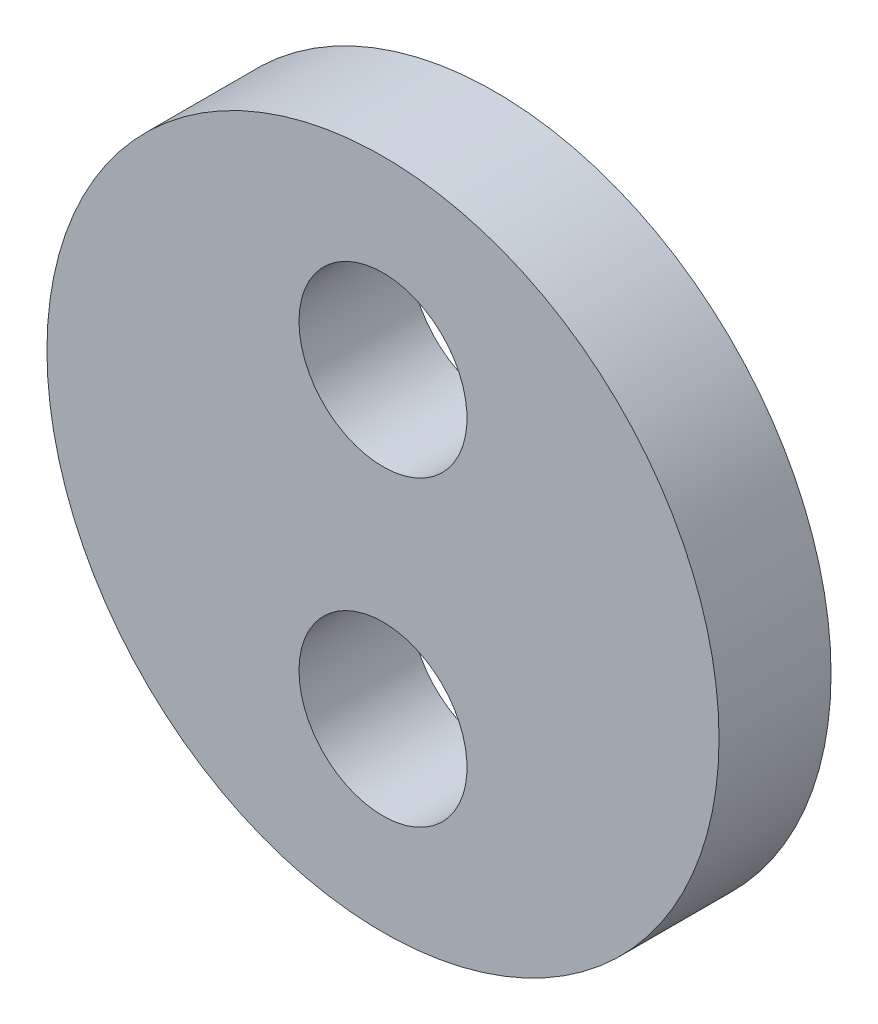
ISO-10303-21;
HEADER;
FILE_DESCRIPTION(('STEP AP214'),'2;1');
FILE_NAME('part.step','',(''),(''),'','','');
FILE_SCHEMA(('AUTOMOTIVE_DESIGN { 1 0 10303 214 1 1 1 1 }'));
ENDSEC;
DATA;
#1=APPLICATION_CONTEXT('core data for automotive mechanical design processes');
#2=APPLICATION_PROTOCOL_DEFINITION('international standard','automotive_design',2000,#1);
#3=PRODUCT_CONTEXT('',#1,'mechanical');
#4=PRODUCT('Part','Part','',(#3));
#5=PRODUCT_RELATED_PRODUCT_CATEGORY('part','',(#4));
#6=PRODUCT_DEFINITION_FORMATION('','',#4);
#7=PRODUCT_DEFINITION_CONTEXT('part definition',#1,'design');
#8=PRODUCT_DEFINITION('design','',#6,#7);
#9=PRODUCT_DEFINITION_SHAPE('','',#8);
#10=(LENGTH_UNIT() NAMED_UNIT(*) SI_UNIT(.MILLI.,.METRE.));
#11=(NAMED_UNIT(*) PLANE_ANGLE_UNIT() SI_UNIT($,.RADIAN.));
#12=(NAMED_UNIT(*) SI_UNIT($,.STERADIAN.) SOLID_ANGLE_UNIT());
#13=UNCERTAINTY_MEASURE_WITH_UNIT(LENGTH_MEASURE(1.E-05),#10,'distance_accuracy_value','');
#14=(GEOMETRIC_REPRESENTATION_CONTEXT(3) GLOBAL_UNCERTAINTY_ASSIGNED_CONTEXT((#13)) GLOBAL_UNIT_ASSIGNED_CONTEXT((#10,
#11,#12)) REPRESENTATION_CONTEXT('',''));
#15=CARTESIAN_POINT('',(0.,0.,0.));
#16=DIRECTION('',(0.,0.,1.));
#17=DIRECTION('',(1.,0.,0.));
#18=AXIS2_PLACEMENT_3D('',#15,#16,#17);
#19=CARTESIAN_POINT('',(0.,-2.02158585779104E-13,2.5));
#20=DIRECTION('',(0.,0.,-1.));
#21=DIRECTION('',(-1.,0.,0.));
#22=AXIS2_PLACEMENT_3D('',#19,#20,#21);
#23=CYLINDRICAL_SURFACE('',#22,6.00000000000001);
#24=CARTESIAN_POINT('',(0.,-2.02158585779104E-13,2.5));
#25=DIRECTION('',(0.,0.,-1.));
#26=DIRECTION('',(-1.,0.,0.));
#27=AXIS2_PLACEMENT_3D('',#24,#25,#26);
#28=CIRCLE('',#27,6.00000000000001);
#29=CARTESIAN_POINT('',(-5.99999999999996,-2.02158585779104E-13,2.5));
#30=VERTEX_POINT('',#29);
#31=EDGE_CURVE('E11',#30,#30,#28,.T.);
#32=ORIENTED_EDGE('',*,*,#31,.T.);
#33=EDGE_LOOP('',(#32));
#34=FACE_BOUND('',#33,.T.);
#35=CARTESIAN_POINT('',(0.,-2.02158585779104E-13,0.5));
#36=DIRECTION('',(0.,0.,-1.));
#37=DIRECTION('',(-1.,0.,0.));
#38=AXIS2_PLACEMENT_3D('',#35,#36,#37);
#39=CIRCLE('',#38,6.00000000000001);
#40=CARTESIAN_POINT('',(-5.99999999999996,-2.02158585779104E-13,0.499999999999999));
#41=VERTEX_POINT('',#40);
#42=EDGE_CURVE('E43',#41,#41,#39,.T.);
#43=ORIENTED_EDGE('',*,*,#42,.F.);
#44=EDGE_LOOP('',(#43));
#45=FACE_BOUND('',#44,.T.);
#46=ADVANCED_FACE('F40',(#34,#45),#23,.T.);
#47=CARTESIAN_POINT('',(0.,-2.02158585779104E-13,2.5));
#48=DIRECTION('',(0.,0.,-1.));
#49=DIRECTION('',(-1.,0.,0.));
#50=AXIS2_PLACEMENT_3D('',#47,#48,#49);
#51=PLANE('',#50);
#52=CARTESIAN_POINT('',(0.,-2.7,2.5));
#53=DIRECTION('',(0.,0.,-1.));
#54=DIRECTION('',(-1.,0.,0.));
#55=AXIS2_PLACEMENT_3D('',#52,#53,#54);
#56=CIRCLE('',#55,1.5);
#57=CARTESIAN_POINT('',(-1.5,-2.7,2.5));
#58=VERTEX_POINT('',#57);
#59=EDGE_CURVE('E55',#58,#58,#56,.T.);
#60=ORIENTED_EDGE('',*,*,#59,.T.);
#61=EDGE_LOOP('',(#60));
#62=FACE_BOUND('',#61,.T.);
#63=CARTESIAN_POINT('',(0.,2.7,2.5));
#64=DIRECTION('',(0.,0.,-1.));
#65=DIRECTION('',(-1.,0.,0.));
#66=AXIS2_PLACEMENT_3D('',#63,#64,#65);
#67=CIRCLE('',#66,1.5);
#68=CARTESIAN_POINT('',(-1.5,2.7,2.5));
#69=VERTEX_POINT('',#68);
#70=EDGE_CURVE('E50',#69,#69,#67,.T.);
#71=ORIENTED_EDGE('',*,*,#70,.T.);
#72=EDGE_LOOP('',(#71));
#73=FACE_BOUND('',#72,.T.);
#74=ORIENTED_EDGE('',*,*,#31,.F.);
#75=EDGE_LOOP('',(#74));
#76=FACE_BOUND('',#75,.T.);
#77=ADVANCED_FACE('F64',(#62,#73,#76),#51,.F.);
#78=CARTESIAN_POINT('',(0.,-2.02158585779104E-13,0.5));
#79=DIRECTION('',(0.,0.,-1.));
#80=DIRECTION('',(-1.,0.,0.));
#81=AXIS2_PLACEMENT_3D('',#78,#79,#80);
#82=PLANE('',#81);
#83=CARTESIAN_POINT('',(0.,-2.7,0.5));
#84=DIRECTION('',(0.,0.,-1.));
#85=DIRECTION('',(-1.,0.,0.));
#86=AXIS2_PLACEMENT_3D('',#83,#84,#85);
#87=CIRCLE('',#86,1.5);
#88=CARTESIAN_POINT('',(-1.5,-2.7,0.5));
#89=VERTEX_POINT('',#88);
#90=EDGE_CURVE('E58',#89,#89,#87,.T.);
#91=ORIENTED_EDGE('',*,*,#90,.F.);
#92=EDGE_LOOP('',(#91));
#93=FACE_BOUND('',#92,.T.);
#94=CARTESIAN_POINT('',(0.,2.7,0.5));
#95=DIRECTION('',(0.,0.,-1.));
#96=DIRECTION('',(-1.,0.,0.));
#97=AXIS2_PLACEMENT_3D('',#94,#95,#96);
#98=CIRCLE('',#97,1.5);
#99=CARTESIAN_POINT('',(-1.5,2.7,0.5));
#100=VERTEX_POINT('',#99);
#101=EDGE_CURVE('E52',#100,#100,#98,.T.);
#102=ORIENTED_EDGE('',*,*,#101,.F.);
#103=EDGE_LOOP('',(#102));
#104=FACE_BOUND('',#103,.T.);
#105=ORIENTED_EDGE('',*,*,#42,.T.);
#106=EDGE_LOOP('',(#105));
#107=FACE_BOUND('',#106,.T.);
#108=ADVANCED_FACE('F74',(#93,#104,#107),#82,.T.);
#109=CARTESIAN_POINT('',(0.,2.7,2.5));
#110=DIRECTION('',(0.,0.,-1.));
#111=DIRECTION('',(-1.,0.,0.));
#112=AXIS2_PLACEMENT_3D('',#109,#110,#111);
#113=CYLINDRICAL_SURFACE('',#112,1.5);
#114=ORIENTED_EDGE('',*,*,#70,.F.);
#115=EDGE_LOOP('',(#114));
#116=FACE_BOUND('',#115,.T.);
#117=ORIENTED_EDGE('',*,*,#101,.T.);
#118=EDGE_LOOP('',(#117));
#119=FACE_BOUND('',#118,.T.);
#120=ADVANCED_FACE('F70',(#116,#119),#113,.F.);
#121=CARTESIAN_POINT('',(0.,-2.7,2.5));
#122=DIRECTION('',(0.,0.,-1.));
#123=DIRECTION('',(-1.,0.,0.));
#124=AXIS2_PLACEMENT_3D('',#121,#122,#123);
#125=CYLINDRICAL_SURFACE('',#124,1.5);
#126=ORIENTED_EDGE('',*,*,#59,.F.);
#127=EDGE_LOOP('',(#126));
#128=FACE_BOUND('',#127,.T.);
#129=ORIENTED_EDGE('',*,*,#90,.T.);
#130=EDGE_LOOP('',(#129));
#131=FACE_BOUND('',#130,.T.);
#132=ADVANCED_FACE('F67',(#128,#131),#125,.F.);
#133=CLOSED_SHELL('',(#46,#77,#108,#120,#132));
#134=MANIFOLD_SOLID_BREP('B2',#133);
#135=ADVANCED_BREP_SHAPE_REPRESENTATION('',(#18,#134),#14);
#136=SHAPE_DEFINITION_REPRESENTATION(#9,#135);
ENDSEC;
END-ISO-10303-21;
